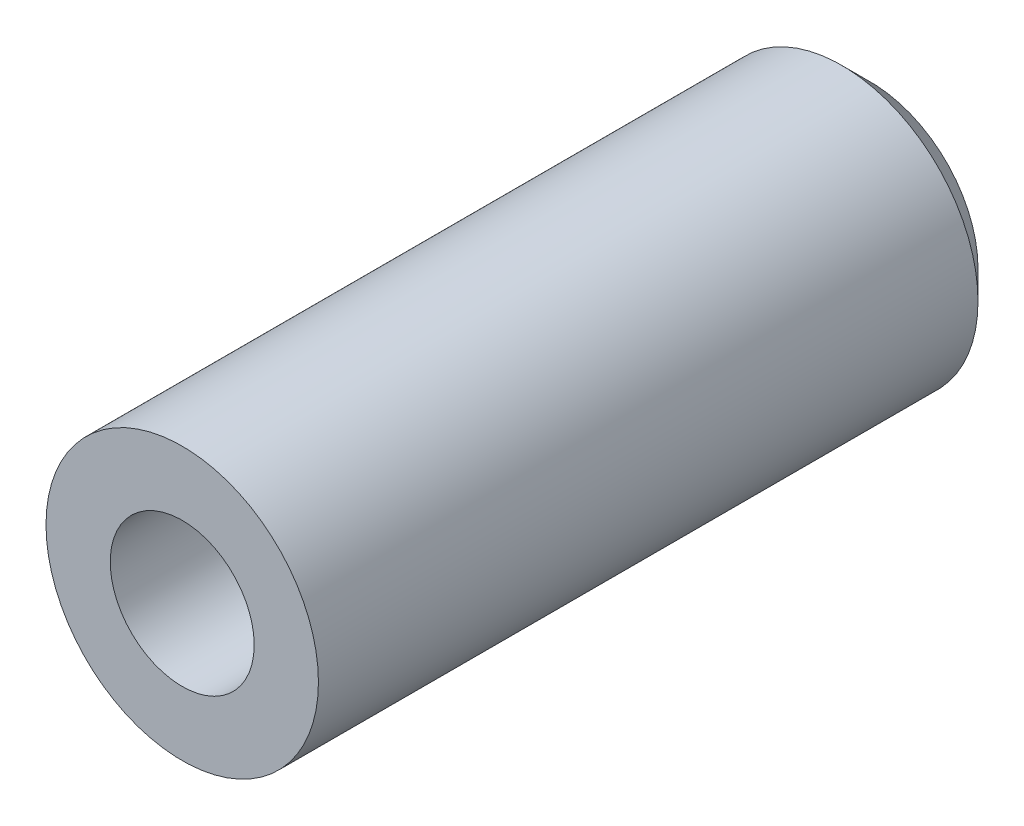
ISO-10303-21;
HEADER;
FILE_DESCRIPTION(('STEP AP214'),'2;1');
FILE_NAME('part.step','',(''),(''),'','','');
FILE_SCHEMA(('AUTOMOTIVE_DESIGN { 1 0 10303 214 1 1 1 1 }'));
ENDSEC;
DATA;
#1=APPLICATION_CONTEXT('core data for automotive mechanical design processes');
#2=APPLICATION_PROTOCOL_DEFINITION('international standard','automotive_design',2000,#1);
#3=PRODUCT_CONTEXT('',#1,'mechanical');
#4=PRODUCT('Part','Part','',(#3));
#5=PRODUCT_RELATED_PRODUCT_CATEGORY('part','',(#4));
#6=PRODUCT_DEFINITION_FORMATION('','',#4);
#7=PRODUCT_DEFINITION_CONTEXT('part definition',#1,'design');
#8=PRODUCT_DEFINITION('design','',#6,#7);
#9=PRODUCT_DEFINITION_SHAPE('','',#8);
#10=(LENGTH_UNIT() NAMED_UNIT(*) SI_UNIT(.MILLI.,.METRE.));
#11=(NAMED_UNIT(*) PLANE_ANGLE_UNIT() SI_UNIT($,.RADIAN.));
#12=(NAMED_UNIT(*) SI_UNIT($,.STERADIAN.) SOLID_ANGLE_UNIT());
#13=UNCERTAINTY_MEASURE_WITH_UNIT(LENGTH_MEASURE(1.E-05),#10,'distance_accuracy_value','');
#14=(GEOMETRIC_REPRESENTATION_CONTEXT(3) GLOBAL_UNCERTAINTY_ASSIGNED_CONTEXT((#13)) GLOBAL_UNIT_ASSIGNED_CONTEXT((#10,
#11,#12)) REPRESENTATION_CONTEXT('',''));
#15=CARTESIAN_POINT('',(0.,0.,0.));
#16=DIRECTION('',(0.,0.,1.));
#17=DIRECTION('',(1.,0.,0.));
#18=AXIS2_PLACEMENT_3D('',#15,#16,#17);
#19=CARTESIAN_POINT('',(2.375,0.,0.));
#20=DIRECTION('',(0.,0.,1.));
#21=DIRECTION('',(1.,0.,0.));
#22=AXIS2_PLACEMENT_3D('',#19,#20,#21);
#23=PLANE('',#22);
#24=CARTESIAN_POINT('',(0.,0.,0.));
#25=DIRECTION('',(0.,0.,1.));
#26=DIRECTION('',(1.,0.,0.));
#27=AXIS2_PLACEMENT_3D('',#24,#25,#26);
#28=CIRCLE('',#27,2.375);
#29=CARTESIAN_POINT('',(2.375,0.,0.));
#30=VERTEX_POINT('',#29);
#31=EDGE_CURVE('E64',#30,#30,#28,.T.);
#32=ORIENTED_EDGE('',*,*,#31,.T.);
#33=EDGE_LOOP('',(#32));
#34=FACE_BOUND('',#33,.T.);
#35=CARTESIAN_POINT('',(0.,0.,0.));
#36=DIRECTION('',(0.,0.,1.));
#37=DIRECTION('',(1.,0.,0.));
#38=AXIS2_PLACEMENT_3D('',#35,#36,#37);
#39=CIRCLE('',#38,1.255);
#40=CARTESIAN_POINT('',(1.255,0.,0.));
#41=VERTEX_POINT('',#40);
#42=EDGE_CURVE('E10',#41,#41,#39,.T.);
#43=ORIENTED_EDGE('',*,*,#42,.F.);
#44=EDGE_LOOP('',(#43));
#45=FACE_BOUND('',#44,.T.);
#46=ADVANCED_FACE('F41',(#34,#45),#23,.T.);
#47=CARTESIAN_POINT('',(0.,0.,0.));
#48=DIRECTION('',(0.,0.,1.));
#49=DIRECTION('',(1.,0.,0.));
#50=AXIS2_PLACEMENT_3D('',#47,#48,#49);
#51=CYLINDRICAL_SURFACE('',#50,1.255);
#52=ORIENTED_EDGE('',*,*,#42,.T.);
#53=EDGE_LOOP('',(#52));
#54=FACE_BOUND('',#53,.T.);
#55=CARTESIAN_POINT('',(0.,0.,-12.));
#56=DIRECTION('',(0.,0.,1.));
#57=DIRECTION('',(1.,0.,0.));
#58=AXIS2_PLACEMENT_3D('',#55,#56,#57);
#59=CIRCLE('',#58,1.255);
#60=CARTESIAN_POINT('',(1.255,0.,-12.));
#61=VERTEX_POINT('',#60);
#62=EDGE_CURVE('E48',#61,#61,#59,.T.);
#63=ORIENTED_EDGE('',*,*,#62,.F.);
#64=EDGE_LOOP('',(#63));
#65=FACE_BOUND('',#64,.T.);
#66=ADVANCED_FACE('F83',(#54,#65),#51,.F.);
#67=CARTESIAN_POINT('',(1.255,0.,-12.));
#68=DIRECTION('',(0.,0.,-1.));
#69=DIRECTION('',(-1.,0.,0.));
#70=AXIS2_PLACEMENT_3D('',#67,#68,#69);
#71=PLANE('',#70);
#72=ORIENTED_EDGE('',*,*,#62,.T.);
#73=EDGE_LOOP('',(#72));
#74=FACE_BOUND('',#73,.T.);
#75=CARTESIAN_POINT('',(0.,0.,-12.));
#76=DIRECTION('',(0.,0.,1.));
#77=DIRECTION('',(1.,0.,0.));
#78=AXIS2_PLACEMENT_3D('',#75,#76,#77);
#79=CIRCLE('',#78,1.875);
#80=CARTESIAN_POINT('',(1.875,0.,-12.));
#81=VERTEX_POINT('',#80);
#82=EDGE_CURVE('E53',#81,#81,#79,.T.);
#83=ORIENTED_EDGE('',*,*,#82,.F.);
#84=EDGE_LOOP('',(#83));
#85=FACE_BOUND('',#84,.T.);
#86=ADVANCED_FACE('F79',(#74,#85),#71,.T.);
#87=CARTESIAN_POINT('',(0.,0.,-11.5));
#88=DIRECTION('',(0.,0.,1.));
#89=DIRECTION('',(1.,0.,0.));
#90=AXIS2_PLACEMENT_3D('',#87,#88,#89);
#91=CONICAL_SURFACE('',#90,2.375,0.785398163397448);
#92=ORIENTED_EDGE('',*,*,#82,.T.);
#93=EDGE_LOOP('',(#92));
#94=FACE_BOUND('',#93,.T.);
#95=CARTESIAN_POINT('',(0.,0.,-11.5));
#96=DIRECTION('',(0.,0.,1.));
#97=DIRECTION('',(1.,0.,0.));
#98=AXIS2_PLACEMENT_3D('',#95,#96,#97);
#99=CIRCLE('',#98,2.375);
#100=CARTESIAN_POINT('',(2.375,0.,-11.5));
#101=VERTEX_POINT('',#100);
#102=EDGE_CURVE('E58',#101,#101,#99,.T.);
#103=ORIENTED_EDGE('',*,*,#102,.F.);
#104=EDGE_LOOP('',(#103));
#105=FACE_BOUND('',#104,.T.);
#106=ADVANCED_FACE('F73',(#94,#105),#91,.T.);
#107=CARTESIAN_POINT('',(0.,0.,0.));
#108=DIRECTION('',(0.,0.,1.));
#109=DIRECTION('',(1.,0.,0.));
#110=AXIS2_PLACEMENT_3D('',#107,#108,#109);
#111=CYLINDRICAL_SURFACE('',#110,2.375);
#112=ORIENTED_EDGE('',*,*,#102,.T.);
#113=EDGE_LOOP('',(#112));
#114=FACE_BOUND('',#113,.T.);
#115=ORIENTED_EDGE('',*,*,#31,.F.);
#116=EDGE_LOOP('',(#115));
#117=FACE_BOUND('',#116,.T.);
#118=ADVANCED_FACE('F71',(#114,#117),#111,.T.);
#119=CLOSED_SHELL('',(#46,#66,#86,#106,#118));
#120=MANIFOLD_SOLID_BREP('B2',#119);
#121=ADVANCED_BREP_SHAPE_REPRESENTATION('',(#18,#120),#14);
#122=SHAPE_DEFINITION_REPRESENTATION(#9,#121);
ENDSEC;
END-ISO-10303-21;
